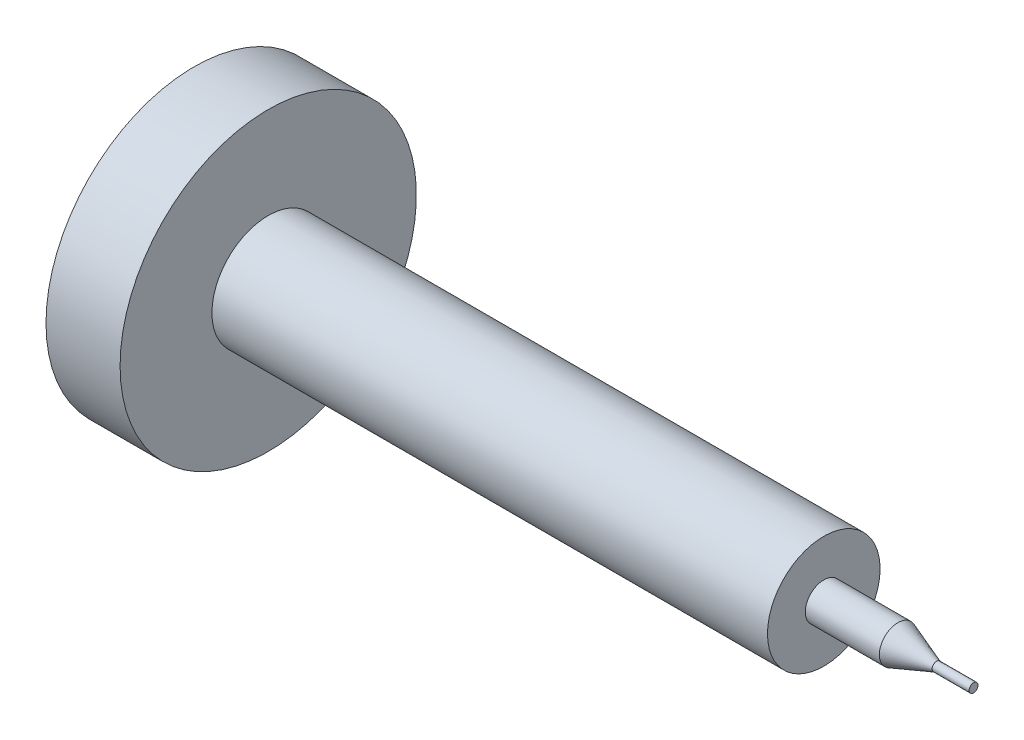
ISO-10303-21;
HEADER;
FILE_DESCRIPTION(('STEP AP214'),'2;1');
FILE_NAME('part.step','',(''),(''),'','','');
FILE_SCHEMA(('AUTOMOTIVE_DESIGN { 1 0 10303 214 1 1 1 1 }'));
ENDSEC;
DATA;
#1=APPLICATION_CONTEXT('core data for automotive mechanical design processes');
#2=APPLICATION_PROTOCOL_DEFINITION('international standard','automotive_design',2000,#1);
#3=PRODUCT_CONTEXT('',#1,'mechanical');
#4=PRODUCT('Part','Part','',(#3));
#5=PRODUCT_RELATED_PRODUCT_CATEGORY('part','',(#4));
#6=PRODUCT_DEFINITION_FORMATION('','',#4);
#7=PRODUCT_DEFINITION_CONTEXT('part definition',#1,'design');
#8=PRODUCT_DEFINITION('design','',#6,#7);
#9=PRODUCT_DEFINITION_SHAPE('','',#8);
#10=(LENGTH_UNIT() NAMED_UNIT(*) SI_UNIT(.MILLI.,.METRE.));
#11=(NAMED_UNIT(*) PLANE_ANGLE_UNIT() SI_UNIT($,.RADIAN.));
#12=(NAMED_UNIT(*) SI_UNIT($,.STERADIAN.) SOLID_ANGLE_UNIT());
#13=UNCERTAINTY_MEASURE_WITH_UNIT(LENGTH_MEASURE(1.E-05),#10,'distance_accuracy_value','');
#14=(GEOMETRIC_REPRESENTATION_CONTEXT(3) GLOBAL_UNCERTAINTY_ASSIGNED_CONTEXT((#13)) GLOBAL_UNIT_ASSIGNED_CONTEXT((#10,
#11,#12)) REPRESENTATION_CONTEXT('',''));
#15=CARTESIAN_POINT('',(0.,0.,0.));
#16=DIRECTION('',(0.,0.,1.));
#17=DIRECTION('',(1.,0.,0.));
#18=AXIS2_PLACEMENT_3D('',#15,#16,#17);
#19=CARTESIAN_POINT('',(0.,0.,0.));
#20=DIRECTION('',(1.,0.,0.));
#21=DIRECTION('',(0.,0.,-1.));
#22=AXIS2_PLACEMENT_3D('',#19,#20,#21);
#23=PLANE('',#22);
#24=CARTESIAN_POINT('',(0.,0.,0.));
#25=DIRECTION('',(-1.,0.,0.));
#26=DIRECTION('',(0.,0.,1.));
#27=AXIS2_PLACEMENT_3D('',#24,#25,#26);
#28=CIRCLE('',#27,6.35);
#29=CARTESIAN_POINT('',(0.,0.,6.35));
#30=VERTEX_POINT('',#29);
#31=EDGE_CURVE('E10',#30,#30,#28,.T.);
#32=ORIENTED_EDGE('',*,*,#31,.T.);
#33=EDGE_LOOP('',(#32));
#34=FACE_BOUND('',#33,.T.);
#35=ADVANCED_FACE('F51',(#34),#23,.F.);
#36=CARTESIAN_POINT('',(0.,0.,0.));
#37=DIRECTION('',(-1.,0.,0.));
#38=DIRECTION('',(0.,0.,1.));
#39=AXIS2_PLACEMENT_3D('',#36,#37,#38);
#40=CYLINDRICAL_SURFACE('',#39,6.35);
#41=ORIENTED_EDGE('',*,*,#31,.F.);
#42=EDGE_LOOP('',(#41));
#43=FACE_BOUND('',#42,.T.);
#44=CARTESIAN_POINT('',(3.175,0.,0.));
#45=DIRECTION('',(-1.,0.,0.));
#46=DIRECTION('',(0.,0.,1.));
#47=AXIS2_PLACEMENT_3D('',#44,#45,#46);
#48=CIRCLE('',#47,6.35);
#49=CARTESIAN_POINT('',(3.175,0.,6.35));
#50=VERTEX_POINT('',#49);
#51=EDGE_CURVE('E57',#50,#50,#48,.T.);
#52=ORIENTED_EDGE('',*,*,#51,.T.);
#53=EDGE_LOOP('',(#52));
#54=FACE_BOUND('',#53,.T.);
#55=ADVANCED_FACE('F95',(#43,#54),#40,.T.);
#56=CARTESIAN_POINT('',(3.175,6.35,0.));
#57=DIRECTION('',(-1.,0.,0.));
#58=DIRECTION('',(0.,0.,1.));
#59=AXIS2_PLACEMENT_3D('',#56,#57,#58);
#60=PLANE('',#59);
#61=ORIENTED_EDGE('',*,*,#51,.F.);
#62=EDGE_LOOP('',(#61));
#63=FACE_BOUND('',#62,.T.);
#64=CARTESIAN_POINT('',(3.175,0.,0.));
#65=DIRECTION('',(-1.,0.,0.));
#66=DIRECTION('',(0.,0.,1.));
#67=AXIS2_PLACEMENT_3D('',#64,#65,#66);
#68=CIRCLE('',#67,2.413);
#69=CARTESIAN_POINT('',(3.175,0.,2.413));
#70=VERTEX_POINT('',#69);
#71=EDGE_CURVE('E61',#70,#70,#68,.T.);
#72=ORIENTED_EDGE('',*,*,#71,.T.);
#73=EDGE_LOOP('',(#72));
#74=FACE_BOUND('',#73,.T.);
#75=ADVANCED_FACE('F99',(#63,#74),#60,.F.);
#76=CARTESIAN_POINT('',(0.,0.,0.));
#77=DIRECTION('',(-1.,0.,0.));
#78=DIRECTION('',(0.,0.,1.));
#79=AXIS2_PLACEMENT_3D('',#76,#77,#78);
#80=CYLINDRICAL_SURFACE('',#79,2.413);
#81=ORIENTED_EDGE('',*,*,#71,.F.);
#82=EDGE_LOOP('',(#81));
#83=FACE_BOUND('',#82,.T.);
#84=CARTESIAN_POINT('',(26.9875,0.,0.));
#85=DIRECTION('',(-1.,0.,0.));
#86=DIRECTION('',(0.,0.,1.));
#87=AXIS2_PLACEMENT_3D('',#84,#85,#86);
#88=CIRCLE('',#87,2.413);
#89=CARTESIAN_POINT('',(26.9875,0.,2.413));
#90=VERTEX_POINT('',#89);
#91=EDGE_CURVE('E65',#90,#90,#88,.T.);
#92=ORIENTED_EDGE('',*,*,#91,.T.);
#93=EDGE_LOOP('',(#92));
#94=FACE_BOUND('',#93,.T.);
#95=ADVANCED_FACE('F104',(#83,#94),#80,.T.);
#96=CARTESIAN_POINT('',(26.9875,2.413,0.));
#97=DIRECTION('',(-1.,0.,0.));
#98=DIRECTION('',(0.,0.,1.));
#99=AXIS2_PLACEMENT_3D('',#96,#97,#98);
#100=PLANE('',#99);
#101=ORIENTED_EDGE('',*,*,#91,.F.);
#102=EDGE_LOOP('',(#101));
#103=FACE_BOUND('',#102,.T.);
#104=CARTESIAN_POINT('',(26.9875,0.,0.));
#105=DIRECTION('',(-1.,0.,0.));
#106=DIRECTION('',(0.,0.,1.));
#107=AXIS2_PLACEMENT_3D('',#104,#105,#106);
#108=CIRCLE('',#107,0.79375);
#109=CARTESIAN_POINT('',(26.9875,0.,0.79375));
#110=VERTEX_POINT('',#109);
#111=EDGE_CURVE('E70',#110,#110,#108,.T.);
#112=ORIENTED_EDGE('',*,*,#111,.T.);
#113=EDGE_LOOP('',(#112));
#114=FACE_BOUND('',#113,.T.);
#115=ADVANCED_FACE('F110',(#103,#114),#100,.F.);
#116=CARTESIAN_POINT('',(0.,0.,0.));
#117=DIRECTION('',(-1.,0.,0.));
#118=DIRECTION('',(0.,0.,1.));
#119=AXIS2_PLACEMENT_3D('',#116,#117,#118);
#120=CYLINDRICAL_SURFACE('',#119,0.79375);
#121=ORIENTED_EDGE('',*,*,#111,.F.);
#122=EDGE_LOOP('',(#121));
#123=FACE_BOUND('',#122,.T.);
#124=CARTESIAN_POINT('',(30.1625,0.,0.));
#125=DIRECTION('',(-1.,0.,0.));
#126=DIRECTION('',(0.,0.,1.));
#127=AXIS2_PLACEMENT_3D('',#124,#125,#126);
#128=CIRCLE('',#127,0.79375);
#129=CARTESIAN_POINT('',(30.1625,0.,0.793749999999999));
#130=VERTEX_POINT('',#129);
#131=EDGE_CURVE('E73',#130,#130,#128,.T.);
#132=ORIENTED_EDGE('',*,*,#131,.T.);
#133=EDGE_LOOP('',(#132));
#134=FACE_BOUND('',#133,.T.);
#135=ADVANCED_FACE('F114',(#123,#134),#120,.T.);
#136=CARTESIAN_POINT('',(31.819915753286,0.,0.));
#137=DIRECTION('',(-1.,0.,0.));
#138=DIRECTION('',(0.,0.,1.));
#139=AXIS2_PLACEMENT_3D('',#136,#137,#138);
#140=CONICAL_SURFACE('',#139,0.1905,0.349065850398866);
#141=CARTESIAN_POINT('',(31.819915753286,0.,0.));
#142=DIRECTION('',(-1.,0.,0.));
#143=DIRECTION('',(0.,0.,1.));
#144=AXIS2_PLACEMENT_3D('',#141,#142,#143);
#145=CIRCLE('',#144,0.1905);
#146=CARTESIAN_POINT('',(31.819915753286,0.,0.190499999999999));
#147=VERTEX_POINT('',#146);
#148=EDGE_CURVE('E76',#147,#147,#145,.T.);
#149=CARTESIAN_POINT('',(30.1625,0.,0.793749999999999));
#150=CARTESIAN_POINT('',(30.1797647474301,0.,0.787466145833333));
#151=CARTESIAN_POINT('',(30.1970294948601,0.,0.781182291666666));
#152=CARTESIAN_POINT('',(30.2315589897203,0.,0.768614583333333));
#153=CARTESIAN_POINT('',(30.2488237371503,0.,0.762330729166666));
#154=CARTESIAN_POINT('',(30.2833532320104,0.,0.749763020833333));
#155=CARTESIAN_POINT('',(30.3006179794405,0.,0.743479166666666));
#156=CARTESIAN_POINT('',(30.3351474743006,0.,0.730911458333332));
#157=CARTESIAN_POINT('',(30.3524122217307,0.,0.724627604166666));
#158=CARTESIAN_POINT('',(30.3869417165908,0.,0.712059895833333));
#159=CARTESIAN_POINT('',(30.4042064640209,0.,0.705776041666666));
#160=CARTESIAN_POINT('',(30.438735958881,0.,0.693208333333333));
#161=CARTESIAN_POINT('',(30.4560007063111,0.,0.686924479166666));
#162=CARTESIAN_POINT('',(30.4905302011712,0.,0.674356770833332));
#163=CARTESIAN_POINT('',(30.5077949486013,0.,0.668072916666666));
#164=CARTESIAN_POINT('',(30.5423244434614,0.,0.655505208333333));
#165=CARTESIAN_POINT('',(30.5595891908914,0.,0.649221354166666));
#166=CARTESIAN_POINT('',(30.5941186857516,0.,0.636653645833333));
#167=CARTESIAN_POINT('',(30.6113834331816,0.,0.630369791666666));
#168=CARTESIAN_POINT('',(30.6459129280418,0.,0.617802083333332));
#169=CARTESIAN_POINT('',(30.6631776754718,0.,0.611518229166666));
#170=CARTESIAN_POINT('',(30.6977071703319,0.,0.598950520833333));
#171=CARTESIAN_POINT('',(30.714971917762,0.,0.592666666666666));
#172=CARTESIAN_POINT('',(30.7495014126221,0.,0.580098958333333));
#173=CARTESIAN_POINT('',(30.7667661600522,0.,0.573815104166666));
#174=CARTESIAN_POINT('',(30.8012956549123,0.,0.561247395833332));
#175=CARTESIAN_POINT('',(30.8185604023424,0.,0.554963541666666));
#176=CARTESIAN_POINT('',(30.8530898972025,0.,0.542395833333333));
#177=CARTESIAN_POINT('',(30.8703546446326,0.,0.536111979166666));
#178=CARTESIAN_POINT('',(30.9048841394927,0.,0.523544270833332));
#179=CARTESIAN_POINT('',(30.9221488869228,0.,0.517260416666666));
#180=CARTESIAN_POINT('',(30.9566783817829,0.,0.504692708333333));
#181=CARTESIAN_POINT('',(30.9739431292129,0.,0.498408854166666));
#182=CARTESIAN_POINT('',(31.0084726240731,0.,0.485841145833333));
#183=CARTESIAN_POINT('',(31.0257373715031,0.,0.479557291666666));
#184=CARTESIAN_POINT('',(31.0602668663632,0.,0.466989583333332));
#185=CARTESIAN_POINT('',(31.0775316137933,0.,0.460705729166666));
#186=CARTESIAN_POINT('',(31.1120611086534,0.,0.448138020833332));
#187=CARTESIAN_POINT('',(31.1293258560835,0.,0.441854166666666));
#188=CARTESIAN_POINT('',(31.1638553509436,0.,0.429286458333333));
#189=CARTESIAN_POINT('',(31.1811200983737,0.,0.423002604166666));
#190=CARTESIAN_POINT('',(31.2156495932338,0.,0.410434895833332));
#191=CARTESIAN_POINT('',(31.2329143406639,0.,0.404151041666665));
#192=CARTESIAN_POINT('',(31.267443835524,0.,0.391583333333332));
#193=CARTESIAN_POINT('',(31.2847085829541,0.,0.385299479166666));
#194=CARTESIAN_POINT('',(31.3192380778142,0.,0.372731770833332));
#195=CARTESIAN_POINT('',(31.3365028252442,0.,0.366447916666666));
#196=CARTESIAN_POINT('',(31.3710323201044,0.,0.353880208333332));
#197=CARTESIAN_POINT('',(31.3882970675344,0.,0.347596354166666));
#198=CARTESIAN_POINT('',(31.4228265623946,0.,0.335028645833332));
#199=CARTESIAN_POINT('',(31.4400913098246,0.,0.328744791666665));
#200=CARTESIAN_POINT('',(31.4746208046848,0.,0.316177083333332));
#201=CARTESIAN_POINT('',(31.4918855521148,0.,0.309893229166666));
#202=CARTESIAN_POINT('',(31.5264150469749,0.,0.297325520833332));
#203=CARTESIAN_POINT('',(31.543679794405,0.,0.291041666666665));
#204=CARTESIAN_POINT('',(31.5782092892651,0.,0.278473958333332));
#205=CARTESIAN_POINT('',(31.5954740366952,0.,0.272190104166665));
#206=CARTESIAN_POINT('',(31.6300035315553,0.,0.259622395833332));
#207=CARTESIAN_POINT('',(31.6472682789854,0.,0.253338541666666));
#208=CARTESIAN_POINT('',(31.6817977738455,0.,0.240770833333332));
#209=CARTESIAN_POINT('',(31.6990625212756,0.,0.234486979166665));
#210=CARTESIAN_POINT('',(31.7335920161357,0.,0.221919270833332));
#211=CARTESIAN_POINT('',(31.7508567635658,0.,0.215635416666665));
#212=CARTESIAN_POINT('',(31.7853862584259,0.,0.203067708333332));
#213=CARTESIAN_POINT('',(31.8026510058559,0.,0.196783854166665));
#214=CARTESIAN_POINT('',(31.819915753286,0.,0.190499999999999));
#215=B_SPLINE_CURVE_WITH_KNOTS('',3,(#149,#150,#151,#152,#153,#154,#155,#156,#157,#158,#159,
#160,#161,#162,#163,#164,#165,#166,#167,#168,#169,#170,#171,#172,#173,#174,#175,#176,#177,#178,
#179,#180,#181,#182,#183,#184,#185,#186,#187,#188,#189,#190,#191,#192,#193,#194,#195,#196,#197,
#198,#199,#200,#201,#202,#203,#204,#205,#206,#207,#208,#209,#210,#211,#212,#213,#214),
.UNSPECIFIED.,.F.,.F.,(4,2,2,2,2,2,2,2,2,2,2,2,2,2,2,2,2,2,2,2,2,2,2,2,2,2,2,2,2,2,2,2,4),(0.,
0.0551182813874506,0.110236562774901,0.165354844162349,0.220473125549799,0.27559140693725,
0.330709688324697,0.385827969712148,0.440946251099598,0.496064532487046,0.551182813874496,
0.606301095261947,0.661419376649394,0.716537658036845,0.771655939424292,0.826774220811743,
0.881892502199193,0.937010783586641,0.992129064974091,1.04724734636154,1.10236562774899,
1.15748390913644,1.21260219052389,1.26772047191134,1.32283875329879,1.37795703468624,
1.43307531607369,1.48819359746113,1.54331187884858,1.59843016023603,1.65354844162349,
1.70866672301094,1.76378500439839),.UNSPECIFIED.);
#216=EDGE_CURVE('BSEAM91',#130,#147,#215,.T.);
#217=ORIENTED_EDGE('',*,*,#131,.F.);
#218=ORIENTED_EDGE('',*,*,#148,.T.);
#219=ORIENTED_EDGE('',*,*,#216,.T.);
#220=ORIENTED_EDGE('',*,*,#216,.F.);
#221=EDGE_LOOP('',(#217,#219,#218,#220));
#222=FACE_BOUND('',#221,.T.);
#223=ADVANCED_FACE('F91',(#222),#140,.T.);
#224=CARTESIAN_POINT('',(0.,0.,0.));
#225=DIRECTION('',(-1.,0.,0.));
#226=DIRECTION('',(0.,0.,1.));
#227=AXIS2_PLACEMENT_3D('',#224,#225,#226);
#228=CYLINDRICAL_SURFACE('',#227,0.1905);
#229=ORIENTED_EDGE('',*,*,#148,.F.);
#230=EDGE_LOOP('',(#229));
#231=FACE_BOUND('',#230,.T.);
#232=CARTESIAN_POINT('',(33.407415753286,0.,0.));
#233=DIRECTION('',(-1.,0.,0.));
#234=DIRECTION('',(0.,0.,1.));
#235=AXIS2_PLACEMENT_3D('',#232,#233,#234);
#236=CIRCLE('',#235,0.1905);
#237=CARTESIAN_POINT('',(33.407415753286,0.,0.1905));
#238=VERTEX_POINT('',#237);
#239=EDGE_CURVE('E79',#238,#238,#236,.T.);
#240=ORIENTED_EDGE('',*,*,#239,.T.);
#241=EDGE_LOOP('',(#240));
#242=FACE_BOUND('',#241,.T.);
#243=ADVANCED_FACE('F83',(#231,#242),#228,.T.);
#244=CARTESIAN_POINT('',(33.407415753286,0.1905,0.));
#245=DIRECTION('',(-1.,0.,0.));
#246=DIRECTION('',(0.,0.,1.));
#247=AXIS2_PLACEMENT_3D('',#244,#245,#246);
#248=PLANE('',#247);
#249=ORIENTED_EDGE('',*,*,#239,.F.);
#250=EDGE_LOOP('',(#249));
#251=FACE_BOUND('',#250,.T.);
#252=ADVANCED_FACE('F85',(#251),#248,.F.);
#253=CLOSED_SHELL('',(#35,#55,#75,#95,#115,#135,#223,#243,#252));
#254=MANIFOLD_SOLID_BREP('B2',#253);
#255=ADVANCED_BREP_SHAPE_REPRESENTATION('',(#18,#254),#14);
#256=SHAPE_DEFINITION_REPRESENTATION(#9,#255);
ENDSEC;
END-ISO-10303-21;
